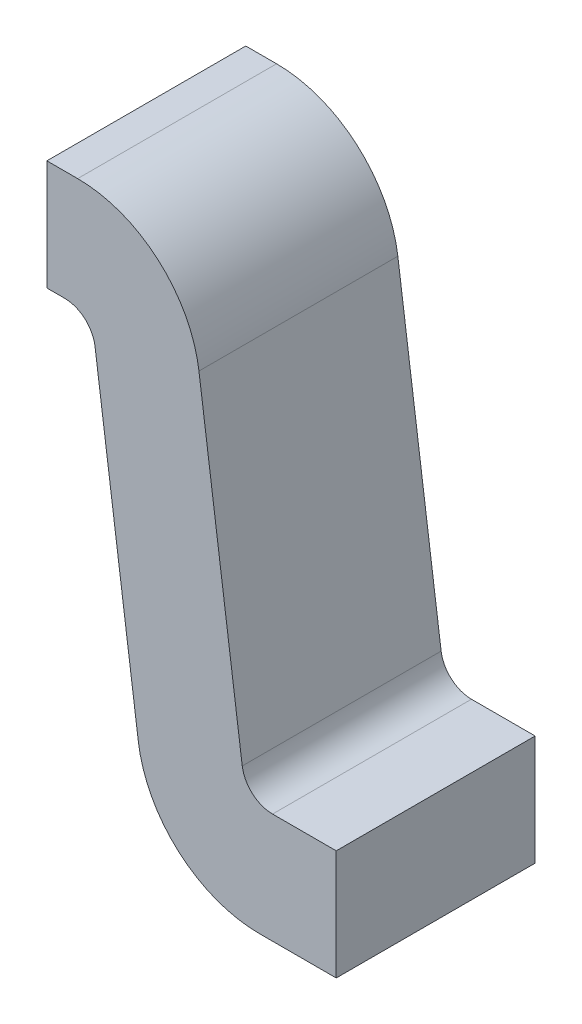
ISO-10303-21;
HEADER;
FILE_DESCRIPTION(('STEP AP214'),'2;1');
FILE_NAME('part.step','',(''),(''),'','','');
FILE_SCHEMA(('AUTOMOTIVE_DESIGN { 1 0 10303 214 1 1 1 1 }'));
ENDSEC;
DATA;
#1=APPLICATION_CONTEXT('core data for automotive mechanical design processes');
#2=APPLICATION_PROTOCOL_DEFINITION('international standard','automotive_design',2000,#1);
#3=PRODUCT_CONTEXT('',#1,'mechanical');
#4=PRODUCT('Part','Part','',(#3));
#5=PRODUCT_RELATED_PRODUCT_CATEGORY('part','',(#4));
#6=PRODUCT_DEFINITION_FORMATION('','',#4);
#7=PRODUCT_DEFINITION_CONTEXT('part definition',#1,'design');
#8=PRODUCT_DEFINITION('design','',#6,#7);
#9=PRODUCT_DEFINITION_SHAPE('','',#8);
#10=(LENGTH_UNIT() NAMED_UNIT(*) SI_UNIT(.MILLI.,.METRE.));
#11=(NAMED_UNIT(*) PLANE_ANGLE_UNIT() SI_UNIT($,.RADIAN.));
#12=(NAMED_UNIT(*) SI_UNIT($,.STERADIAN.) SOLID_ANGLE_UNIT());
#13=UNCERTAINTY_MEASURE_WITH_UNIT(LENGTH_MEASURE(1.E-05),#10,'distance_accuracy_value','');
#14=(GEOMETRIC_REPRESENTATION_CONTEXT(3) GLOBAL_UNCERTAINTY_ASSIGNED_CONTEXT((#13)) GLOBAL_UNIT_ASSIGNED_CONTEXT((#10,
#11,#12)) REPRESENTATION_CONTEXT('',''));
#15=CARTESIAN_POINT('',(0.,0.,0.));
#16=DIRECTION('',(0.,0.,1.));
#17=DIRECTION('',(1.,0.,0.));
#18=AXIS2_PLACEMENT_3D('',#15,#16,#17);
#19=CARTESIAN_POINT('',(0.577173803538205,-0.998978229823184,0.8125));
#20=DIRECTION('',(1.,0.,0.));
#21=DIRECTION('',(0.,1.,0.));
#22=AXIS2_PLACEMENT_3D('',#19,#20,#21);
#23=PLANE('',#22);
#24=DIRECTION('',(0.,0.,1.));
#25=VECTOR('',#24,1.);
#26=CARTESIAN_POINT('',(0.577173803538205,0.92,0.40625));
#27=LINE('',#26,#25);
#28=CARTESIAN_POINT('',(0.577173803538205,0.92,-0.1625));
#29=VERTEX_POINT('',#28);
#30=CARTESIAN_POINT('',(0.577173803538205,0.92,0.1625));
#31=VERTEX_POINT('',#30);
#32=EDGE_CURVE('E11',#29,#31,#27,.T.);
#33=ORIENTED_EDGE('',*,*,#32,.F.);
#34=DIRECTION('',(0.,1.,0.));
#35=VECTOR('',#34,1.);
#36=CARTESIAN_POINT('',(0.577173803538205,-0.442426422235887,-0.1625));
#37=LINE('',#36,#35);
#38=CARTESIAN_POINT('',(0.577173803538205,0.74,-0.1625));
#39=VERTEX_POINT('',#38);
#40=EDGE_CURVE('E24',#39,#29,#37,.T.);
#41=ORIENTED_EDGE('',*,*,#40,.F.);
#42=DIRECTION('',(0.,0.,-1.));
#43=VECTOR('',#42,1.);
#44=CARTESIAN_POINT('',(0.577173803538205,0.74,0.40625));
#45=LINE('',#44,#43);
#46=CARTESIAN_POINT('',(0.577173803538205,0.74,0.1625));
#47=VERTEX_POINT('',#46);
#48=EDGE_CURVE('E199',#47,#39,#45,.T.);
#49=ORIENTED_EDGE('',*,*,#48,.F.);
#50=DIRECTION('',(0.,-1.,0.));
#51=VECTOR('',#50,1.);
#52=CARTESIAN_POINT('',(0.577173803538205,-0.442426422235887,0.1625));
#53=LINE('',#52,#51);
#54=EDGE_CURVE('E197',#31,#47,#53,.T.);
#55=ORIENTED_EDGE('',*,*,#54,.F.);
#56=EDGE_LOOP('',(#33,#41,#49,#55));
#57=FACE_BOUND('',#56,.T.);
#58=ADVANCED_FACE('F17',(#57),#23,.F.);
#59=CARTESIAN_POINT('',(0.,0.74,0.));
#60=DIRECTION('',(0.,-1.,0.));
#61=DIRECTION('',(1.,0.,0.));
#62=AXIS2_PLACEMENT_3D('',#59,#60,#61);
#63=PLANE('',#62);
#64=ORIENTED_EDGE('',*,*,#48,.T.);
#65=DIRECTION('',(-1.,0.,0.));
#66=VECTOR('',#65,1.);
#67=CARTESIAN_POINT('',(0.,0.74,-0.1625));
#68=LINE('',#67,#66);
#69=CARTESIAN_POINT('',(0.606302284587583,0.74,-0.1625));
#70=VERTEX_POINT('',#69);
#71=EDGE_CURVE('E194',#70,#39,#68,.T.);
#72=ORIENTED_EDGE('',*,*,#71,.F.);
#73=DIRECTION('',(0.,0.,-1.));
#74=VECTOR('',#73,1.);
#75=CARTESIAN_POINT('',(0.606302284587583,0.74,0.));
#76=LINE('',#75,#74);
#77=CARTESIAN_POINT('',(0.606302284587583,0.74,0.1625));
#78=VERTEX_POINT('',#77);
#79=EDGE_CURVE('E191',#78,#70,#76,.T.);
#80=ORIENTED_EDGE('',*,*,#79,.F.);
#81=DIRECTION('',(-1.,0.,0.));
#82=VECTOR('',#81,1.);
#83=CARTESIAN_POINT('',(0.,0.74,0.1625));
#84=LINE('',#83,#82);
#85=EDGE_CURVE('E188',#78,#47,#84,.T.);
#86=ORIENTED_EDGE('',*,*,#85,.T.);
#87=EDGE_LOOP('',(#64,#72,#80,#86));
#88=FACE_BOUND('',#87,.T.);
#89=ADVANCED_FACE('F211',(#88),#63,.T.);
#90=CARTESIAN_POINT('',(0.802007778782483,0.11412538535141,-0.1625));
#91=DIRECTION('',(0.,0.,-1.));
#92=DIRECTION('',(-1.,0.,0.));
#93=AXIS2_PLACEMENT_3D('',#90,#91,#92);
#94=PLANE('',#93);
#95=ORIENTED_EDGE('',*,*,#40,.T.);
#96=DIRECTION('',(-1.,0.,0.));
#97=VECTOR('',#96,1.);
#98=CARTESIAN_POINT('',(-0.65,0.92,-0.1625));
#99=LINE('',#98,#97);
#100=CARTESIAN_POINT('',(0.627475466618115,0.92,-0.1625));
#101=VERTEX_POINT('',#100);
#102=EDGE_CURVE('E186',#101,#29,#99,.T.);
#103=ORIENTED_EDGE('',*,*,#102,.F.);
#104=CARTESIAN_POINT('',(0.627475466618115,0.72,-0.1625));
#105=DIRECTION('',(0.,0.,1.));
#106=DIRECTION('',(0.658058547546723,0.752966764207224,0.));
#107=AXIS2_PLACEMENT_3D('',#104,#105,#106);
#108=CIRCLE('',#107,0.2);
#109=CARTESIAN_POINT('',(0.82567395270018,0.746783579200279,-0.1625));
#110=VERTEX_POINT('',#109);
#111=EDGE_CURVE('E183',#110,#101,#108,.T.);
#112=ORIENTED_EDGE('',*,*,#111,.F.);
#113=DIRECTION('',(0.133917896001395,-0.990992430410323,0.));
#114=VECTOR('',#113,1.);
#115=CARTESIAN_POINT('',(0.902266328267786,0.18,-0.1625));
#116=LINE('',#115,#114);
#117=CARTESIAN_POINT('',(0.896414422159687,0.22330410519993,-0.1625));
#118=VERTEX_POINT('',#117);
#119=EDGE_CURVE('E181',#110,#118,#116,.T.);
#120=ORIENTED_EDGE('',*,*,#119,.T.);
#121=CARTESIAN_POINT('',(0.945964043680203,0.23,-0.1625));
#122=DIRECTION('',(0.,0.,-1.));
#123=DIRECTION('',(-0.658058547546724,-0.752966764207223,0.));
#124=AXIS2_PLACEMENT_3D('',#121,#122,#123);
#125=CIRCLE('',#124,0.05);
#126=CARTESIAN_POINT('',(0.945964043680203,0.18,-0.1625));
#127=VERTEX_POINT('',#126);
#128=EDGE_CURVE('E108',#127,#118,#125,.T.);
#129=ORIENTED_EDGE('',*,*,#128,.F.);
#130=DIRECTION('',(1.,0.,0.));
#131=VECTOR('',#130,1.);
#132=CARTESIAN_POINT('',(1.05,0.18,-0.1625));
#133=LINE('',#132,#131);
#134=CARTESIAN_POINT('',(1.05,0.18,-0.1625));
#135=VERTEX_POINT('',#134);
#136=EDGE_CURVE('E178',#127,#135,#133,.T.);
#137=ORIENTED_EDGE('',*,*,#136,.T.);
#138=DIRECTION('',(0.,-1.,0.));
#139=VECTOR('',#138,1.);
#140=CARTESIAN_POINT('',(1.05,0.,-0.1625));
#141=LINE('',#140,#139);
#142=CARTESIAN_POINT('',(1.05,0.,-0.1625));
#143=VERTEX_POINT('',#142);
#144=EDGE_CURVE('E176',#135,#143,#141,.T.);
#145=ORIENTED_EDGE('',*,*,#144,.T.);
#146=DIRECTION('',(-1.,0.,0.));
#147=VECTOR('',#146,1.);
#148=CARTESIAN_POINT('',(0.75,0.,-0.1625));
#149=LINE('',#148,#147);
#150=CARTESIAN_POINT('',(0.92479086164967,0.,-0.1625));
#151=VERTEX_POINT('',#150);
#152=EDGE_CURVE('E174',#143,#151,#149,.T.);
#153=ORIENTED_EDGE('',*,*,#152,.T.);
#154=CARTESIAN_POINT('',(0.92479086164967,0.2,-0.1625));
#155=DIRECTION('',(0.,0.,1.));
#156=DIRECTION('',(-0.658058547546723,-0.752966764207224,0.));
#157=AXIS2_PLACEMENT_3D('',#154,#155,#156);
#158=CIRCLE('',#157,0.2);
#159=CARTESIAN_POINT('',(0.726592375567605,0.173216420799721,-0.1625));
#160=VERTEX_POINT('',#159);
#161=EDGE_CURVE('E171',#160,#151,#158,.T.);
#162=ORIENTED_EDGE('',*,*,#161,.F.);
#163=DIRECTION('',(-0.133917896001395,0.990992430410323,0.));
#164=VECTOR('',#163,1.);
#165=CARTESIAN_POINT('',(0.65,0.74,-0.1625));
#166=LINE('',#165,#164);
#167=CARTESIAN_POINT('',(0.655851906108099,0.69669589480007,-0.1625));
#168=VERTEX_POINT('',#167);
#169=EDGE_CURVE('E169',#160,#168,#166,.T.);
#170=ORIENTED_EDGE('',*,*,#169,.T.);
#171=CARTESIAN_POINT('',(0.606302284587583,0.69,-0.1625));
#172=DIRECTION('',(0.,0.,-1.));
#173=DIRECTION('',(0.658058547546723,0.752966764207224,0.));
#174=AXIS2_PLACEMENT_3D('',#171,#172,#173);
#175=CIRCLE('',#174,0.05);
#176=EDGE_CURVE('E166',#70,#168,#175,.T.);
#177=ORIENTED_EDGE('',*,*,#176,.F.);
#178=ORIENTED_EDGE('',*,*,#71,.T.);
#179=EDGE_LOOP('',(#95,#103,#112,#120,#129,#137,#145,#153,#162,#170,#177,#178));
#180=FACE_BOUND('',#179,.T.);
#181=ADVANCED_FACE('F202',(#180),#94,.T.);
#182=CARTESIAN_POINT('',(0.65,0.92,0.));
#183=DIRECTION('',(0.,1.,0.));
#184=DIRECTION('',(-1.,0.,0.));
#185=AXIS2_PLACEMENT_3D('',#182,#183,#184);
#186=PLANE('',#185);
#187=ORIENTED_EDGE('',*,*,#32,.T.);
#188=DIRECTION('',(-1.,0.,0.));
#189=VECTOR('',#188,1.);
#190=CARTESIAN_POINT('',(0.802266328267785,0.92,0.1625));
#191=LINE('',#190,#189);
#192=CARTESIAN_POINT('',(0.627475466618115,0.92,0.1625));
#193=VERTEX_POINT('',#192);
#194=EDGE_CURVE('E163',#193,#31,#191,.T.);
#195=ORIENTED_EDGE('',*,*,#194,.F.);
#196=DIRECTION('',(0.,0.,1.));
#197=VECTOR('',#196,1.);
#198=CARTESIAN_POINT('',(0.627475466618115,0.92,0.));
#199=LINE('',#198,#197);
#200=EDGE_CURVE('E160',#101,#193,#199,.T.);
#201=ORIENTED_EDGE('',*,*,#200,.F.);
#202=ORIENTED_EDGE('',*,*,#102,.T.);
#203=EDGE_LOOP('',(#187,#195,#201,#202));
#204=FACE_BOUND('',#203,.T.);
#205=ADVANCED_FACE('F205',(#204),#186,.T.);
#206=CARTESIAN_POINT('',(0.902266328267786,0.18,0.));
#207=DIRECTION('',(0.,1.,0.));
#208=DIRECTION('',(-1.,0.,0.));
#209=AXIS2_PLACEMENT_3D('',#206,#207,#208);
#210=PLANE('',#209);
#211=DIRECTION('',(0.,0.,-1.));
#212=VECTOR('',#211,1.);
#213=CARTESIAN_POINT('',(0.945964043680203,0.18,0.));
#214=LINE('',#213,#212);
#215=CARTESIAN_POINT('',(0.945964043680203,0.18,0.1625));
#216=VERTEX_POINT('',#215);
#217=EDGE_CURVE('E158',#216,#127,#214,.T.);
#218=ORIENTED_EDGE('',*,*,#217,.F.);
#219=DIRECTION('',(-1.,0.,0.));
#220=VECTOR('',#219,1.);
#221=CARTESIAN_POINT('',(1.05,0.18,0.1625));
#222=LINE('',#221,#220);
#223=CARTESIAN_POINT('',(1.05,0.18,0.1625));
#224=VERTEX_POINT('',#223);
#225=EDGE_CURVE('E126',#224,#216,#222,.T.);
#226=ORIENTED_EDGE('',*,*,#225,.F.);
#227=DIRECTION('',(0.,0.,1.));
#228=VECTOR('',#227,1.);
#229=CARTESIAN_POINT('',(1.05,0.18,0.));
#230=LINE('',#229,#228);
#231=EDGE_CURVE('E154',#135,#224,#230,.T.);
#232=ORIENTED_EDGE('',*,*,#231,.F.);
#233=ORIENTED_EDGE('',*,*,#136,.F.);
#234=EDGE_LOOP('',(#218,#226,#232,#233));
#235=FACE_BOUND('',#234,.T.);
#236=ADVANCED_FACE('F235',(#235),#210,.T.);
#237=CARTESIAN_POINT('',(1.05,0.,0.));
#238=DIRECTION('',(1.,0.,0.));
#239=DIRECTION('',(0.,1.,0.));
#240=AXIS2_PLACEMENT_3D('',#237,#238,#239);
#241=PLANE('',#240);
#242=ORIENTED_EDGE('',*,*,#231,.T.);
#243=DIRECTION('',(0.,1.,0.));
#244=VECTOR('',#243,1.);
#245=CARTESIAN_POINT('',(1.05,0.,0.1625));
#246=LINE('',#245,#244);
#247=CARTESIAN_POINT('',(1.05,0.,0.1625));
#248=VERTEX_POINT('',#247);
#249=EDGE_CURVE('E152',#248,#224,#246,.T.);
#250=ORIENTED_EDGE('',*,*,#249,.F.);
#251=DIRECTION('',(0.,0.,-1.));
#252=VECTOR('',#251,1.);
#253=CARTESIAN_POINT('',(1.05,0.,0.));
#254=LINE('',#253,#252);
#255=EDGE_CURVE('E149',#248,#143,#254,.T.);
#256=ORIENTED_EDGE('',*,*,#255,.T.);
#257=ORIENTED_EDGE('',*,*,#144,.F.);
#258=EDGE_LOOP('',(#242,#250,#256,#257));
#259=FACE_BOUND('',#258,.T.);
#260=ADVANCED_FACE('F231',(#259),#241,.T.);
#261=CARTESIAN_POINT('',(0.75,0.,0.));
#262=DIRECTION('',(0.,-1.,0.));
#263=DIRECTION('',(1.,0.,0.));
#264=AXIS2_PLACEMENT_3D('',#261,#262,#263);
#265=PLANE('',#264);
#266=DIRECTION('',(0.,0.,1.));
#267=VECTOR('',#266,1.);
#268=CARTESIAN_POINT('',(0.92479086164967,0.,0.));
#269=LINE('',#268,#267);
#270=CARTESIAN_POINT('',(0.92479086164967,0.,0.1625));
#271=VERTEX_POINT('',#270);
#272=EDGE_CURVE('E147',#151,#271,#269,.T.);
#273=ORIENTED_EDGE('',*,*,#272,.F.);
#274=ORIENTED_EDGE('',*,*,#152,.F.);
#275=ORIENTED_EDGE('',*,*,#255,.F.);
#276=DIRECTION('',(1.,0.,0.));
#277=VECTOR('',#276,1.);
#278=CARTESIAN_POINT('',(0.75,0.,0.1625));
#279=LINE('',#278,#277);
#280=EDGE_CURVE('E144',#271,#248,#279,.T.);
#281=ORIENTED_EDGE('',*,*,#280,.F.);
#282=EDGE_LOOP('',(#273,#274,#275,#281));
#283=FACE_BOUND('',#282,.T.);
#284=ADVANCED_FACE('F227',(#283),#265,.T.);
#285=CARTESIAN_POINT('',(0.92479086164967,0.2,0.));
#286=DIRECTION('',(0.,0.,1.));
#287=DIRECTION('',(-0.658058547546723,-0.752966764207224,0.));
#288=AXIS2_PLACEMENT_3D('',#285,#286,#287);
#289=CYLINDRICAL_SURFACE('',#288,0.2);
#290=CARTESIAN_POINT('',(0.92479086164967,0.2,0.1625));
#291=DIRECTION('',(0.,0.,-1.));
#292=DIRECTION('',(-0.658058547546723,-0.752966764207224,0.));
#293=AXIS2_PLACEMENT_3D('',#290,#291,#292);
#294=CIRCLE('',#293,0.2);
#295=CARTESIAN_POINT('',(0.726592375567605,0.173216420799721,0.1625));
#296=VERTEX_POINT('',#295);
#297=EDGE_CURVE('E142',#271,#296,#294,.T.);
#298=ORIENTED_EDGE('',*,*,#297,.T.);
#299=DIRECTION('',(0.,0.,-1.));
#300=VECTOR('',#299,1.);
#301=CARTESIAN_POINT('',(0.726592375567605,0.173216420799721,0.));
#302=LINE('',#301,#300);
#303=EDGE_CURVE('E139',#296,#160,#302,.T.);
#304=ORIENTED_EDGE('',*,*,#303,.T.);
#305=ORIENTED_EDGE('',*,*,#161,.T.);
#306=ORIENTED_EDGE('',*,*,#272,.T.);
#307=EDGE_LOOP('',(#298,#304,#305,#306));
#308=FACE_BOUND('',#307,.T.);
#309=ADVANCED_FACE('F221',(#308),#289,.T.);
#310=CARTESIAN_POINT('',(0.627475466618115,0.72,0.));
#311=DIRECTION('',(0.,0.,1.));
#312=DIRECTION('',(0.658058547546723,0.752966764207224,0.));
#313=AXIS2_PLACEMENT_3D('',#310,#311,#312);
#314=CYLINDRICAL_SURFACE('',#313,0.2);
#315=CARTESIAN_POINT('',(0.627475466618115,0.72,0.1625));
#316=DIRECTION('',(0.,0.,-1.));
#317=DIRECTION('',(0.658058547546723,0.752966764207224,0.));
#318=AXIS2_PLACEMENT_3D('',#315,#316,#317);
#319=CIRCLE('',#318,0.2);
#320=CARTESIAN_POINT('',(0.82567395270018,0.746783579200279,0.1625));
#321=VERTEX_POINT('',#320);
#322=EDGE_CURVE('E137',#193,#321,#319,.T.);
#323=ORIENTED_EDGE('',*,*,#322,.T.);
#324=DIRECTION('',(0.,0.,-1.));
#325=VECTOR('',#324,1.);
#326=CARTESIAN_POINT('',(0.82567395270018,0.746783579200279,0.));
#327=LINE('',#326,#325);
#328=EDGE_CURVE('E118',#321,#110,#327,.T.);
#329=ORIENTED_EDGE('',*,*,#328,.T.);
#330=ORIENTED_EDGE('',*,*,#111,.T.);
#331=ORIENTED_EDGE('',*,*,#200,.T.);
#332=EDGE_LOOP('',(#323,#329,#330,#331));
#333=FACE_BOUND('',#332,.T.);
#334=ADVANCED_FACE('F207',(#333),#314,.T.);
#335=CARTESIAN_POINT('',(0.65,0.74,0.));
#336=DIRECTION('',(-0.990992430410323,-0.133917896001395,0.));
#337=DIRECTION('',(0.133917896001395,-0.990992430410323,0.));
#338=AXIS2_PLACEMENT_3D('',#335,#336,#337);
#339=PLANE('',#338);
#340=DIRECTION('',(0.,0.,1.));
#341=VECTOR('',#340,1.);
#342=CARTESIAN_POINT('',(0.655851906108099,0.69669589480007,0.));
#343=LINE('',#342,#341);
#344=CARTESIAN_POINT('',(0.655851906108099,0.69669589480007,0.1625));
#345=VERTEX_POINT('',#344);
#346=EDGE_CURVE('E134',#168,#345,#343,.T.);
#347=ORIENTED_EDGE('',*,*,#346,.F.);
#348=ORIENTED_EDGE('',*,*,#169,.F.);
#349=ORIENTED_EDGE('',*,*,#303,.F.);
#350=DIRECTION('',(0.133917896001395,-0.990992430410323,0.));
#351=VECTOR('',#350,1.);
#352=CARTESIAN_POINT('',(0.65,0.74,0.1625));
#353=LINE('',#352,#351);
#354=EDGE_CURVE('E131',#345,#296,#353,.T.);
#355=ORIENTED_EDGE('',*,*,#354,.F.);
#356=EDGE_LOOP('',(#347,#348,#349,#355));
#357=FACE_BOUND('',#356,.T.);
#358=ADVANCED_FACE('F218',(#357),#339,.T.);
#359=CARTESIAN_POINT('',(0.606302284587583,0.69,0.));
#360=DIRECTION('',(0.,0.,1.));
#361=DIRECTION('',(0.658058547546723,0.752966764207224,0.));
#362=AXIS2_PLACEMENT_3D('',#359,#360,#361);
#363=CYLINDRICAL_SURFACE('',#362,0.05);
#364=ORIENTED_EDGE('',*,*,#176,.T.);
#365=ORIENTED_EDGE('',*,*,#346,.T.);
#366=CARTESIAN_POINT('',(0.606302284587583,0.69,0.1625));
#367=DIRECTION('',(0.,0.,1.));
#368=DIRECTION('',(0.658058547546723,0.752966764207224,0.));
#369=AXIS2_PLACEMENT_3D('',#366,#367,#368);
#370=CIRCLE('',#369,0.05);
#371=EDGE_CURVE('E111',#345,#78,#370,.T.);
#372=ORIENTED_EDGE('',*,*,#371,.T.);
#373=ORIENTED_EDGE('',*,*,#79,.T.);
#374=EDGE_LOOP('',(#364,#365,#372,#373));
#375=FACE_BOUND('',#374,.T.);
#376=ADVANCED_FACE('F213',(#375),#363,.F.);
#377=CARTESIAN_POINT('',(0.902266328267786,0.18,0.));
#378=DIRECTION('',(0.990992430410323,0.133917896001395,0.));
#379=DIRECTION('',(-0.133917896001395,0.990992430410323,0.));
#380=AXIS2_PLACEMENT_3D('',#377,#378,#379);
#381=PLANE('',#380);
#382=DIRECTION('',(0.,0.,1.));
#383=VECTOR('',#382,1.);
#384=CARTESIAN_POINT('',(0.896414422159687,0.22330410519993,0.));
#385=LINE('',#384,#383);
#386=CARTESIAN_POINT('',(0.896414422159687,0.22330410519993,0.1625));
#387=VERTEX_POINT('',#386);
#388=EDGE_CURVE('E102',#118,#387,#385,.T.);
#389=ORIENTED_EDGE('',*,*,#388,.F.);
#390=ORIENTED_EDGE('',*,*,#119,.F.);
#391=ORIENTED_EDGE('',*,*,#328,.F.);
#392=DIRECTION('',(-0.133917896001395,0.990992430410323,0.));
#393=VECTOR('',#392,1.);
#394=CARTESIAN_POINT('',(0.902266328267786,0.18,0.1625));
#395=LINE('',#394,#393);
#396=EDGE_CURVE('E112',#387,#321,#395,.T.);
#397=ORIENTED_EDGE('',*,*,#396,.F.);
#398=EDGE_LOOP('',(#389,#390,#391,#397));
#399=FACE_BOUND('',#398,.T.);
#400=ADVANCED_FACE('F116',(#399),#381,.T.);
#401=CARTESIAN_POINT('',(0.945964043680203,0.23,0.));
#402=DIRECTION('',(0.,0.,1.));
#403=DIRECTION('',(-0.658058547546724,-0.752966764207223,0.));
#404=AXIS2_PLACEMENT_3D('',#401,#402,#403);
#405=CYLINDRICAL_SURFACE('',#404,0.05);
#406=ORIENTED_EDGE('',*,*,#128,.T.);
#407=ORIENTED_EDGE('',*,*,#388,.T.);
#408=CARTESIAN_POINT('',(0.945964043680203,0.23,0.1625));
#409=DIRECTION('',(0.,0.,1.));
#410=DIRECTION('',(-0.658058547546724,-0.752966764207223,0.));
#411=AXIS2_PLACEMENT_3D('',#408,#409,#410);
#412=CIRCLE('',#411,0.05);
#413=EDGE_CURVE('E107',#387,#216,#412,.T.);
#414=ORIENTED_EDGE('',*,*,#413,.T.);
#415=ORIENTED_EDGE('',*,*,#217,.T.);
#416=EDGE_LOOP('',(#406,#407,#414,#415));
#417=FACE_BOUND('',#416,.T.);
#418=ADVANCED_FACE('F104',(#417),#405,.F.);
#419=CARTESIAN_POINT('',(0.802007778782483,0.11412538535141,0.1625));
#420=DIRECTION('',(0.,0.,1.));
#421=DIRECTION('',(1.,0.,0.));
#422=AXIS2_PLACEMENT_3D('',#419,#420,#421);
#423=PLANE('',#422);
#424=ORIENTED_EDGE('',*,*,#54,.T.);
#425=ORIENTED_EDGE('',*,*,#85,.F.);
#426=ORIENTED_EDGE('',*,*,#371,.F.);
#427=ORIENTED_EDGE('',*,*,#354,.T.);
#428=ORIENTED_EDGE('',*,*,#297,.F.);
#429=ORIENTED_EDGE('',*,*,#280,.T.);
#430=ORIENTED_EDGE('',*,*,#249,.T.);
#431=ORIENTED_EDGE('',*,*,#225,.T.);
#432=ORIENTED_EDGE('',*,*,#413,.F.);
#433=ORIENTED_EDGE('',*,*,#396,.T.);
#434=ORIENTED_EDGE('',*,*,#322,.F.);
#435=ORIENTED_EDGE('',*,*,#194,.T.);
#436=EDGE_LOOP('',(#424,#425,#426,#427,#428,#429,#430,#431,#432,#433,#434,#435));
#437=FACE_BOUND('',#436,.T.);
#438=ADVANCED_FACE('F124',(#437),#423,.T.);
#439=CLOSED_SHELL('',(#58,#89,#181,#205,#236,#260,#284,#309,#334,#358,#376,#400,#418,#438));
#440=MANIFOLD_SOLID_BREP('B1',#439);
#441=ADVANCED_BREP_SHAPE_REPRESENTATION('',(#18,#440),#14);
#442=SHAPE_DEFINITION_REPRESENTATION(#9,#441);
ENDSEC;
END-ISO-10303-21;
